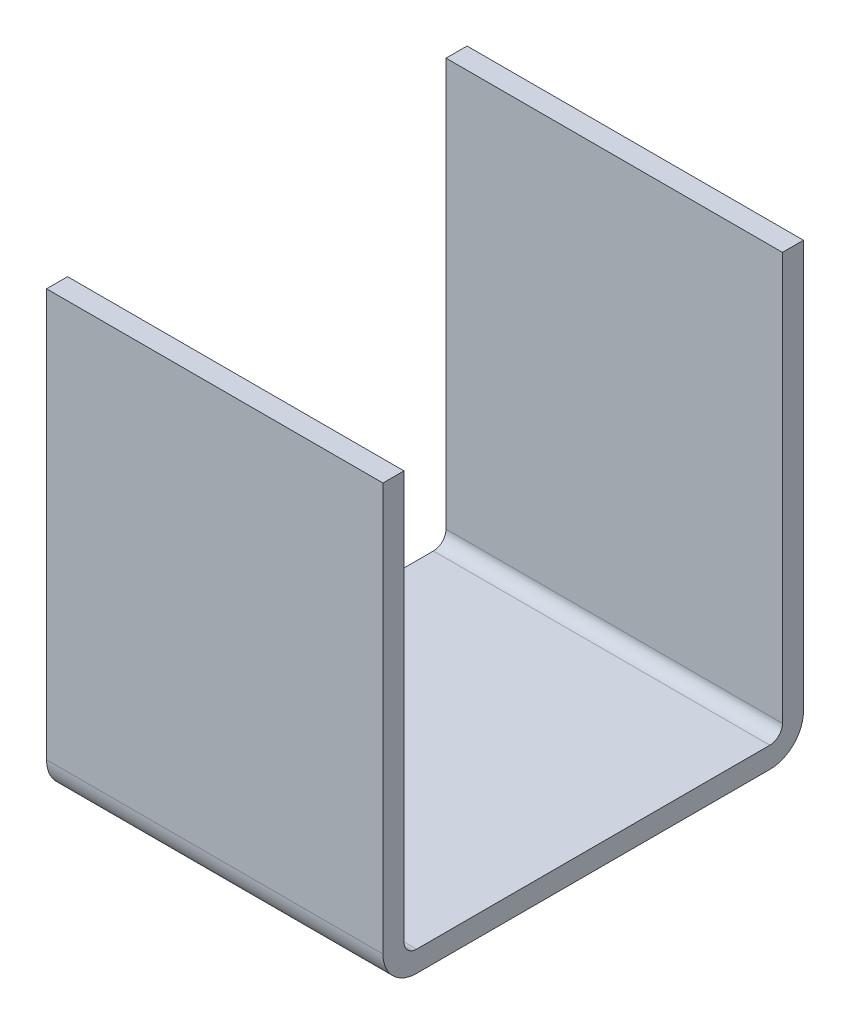
ISO-10303-21;
HEADER;
FILE_DESCRIPTION(('STEP AP214'),'2;1');
FILE_NAME('part.step','',(''),(''),'','','');
FILE_SCHEMA(('AUTOMOTIVE_DESIGN { 1 0 10303 214 1 1 1 1 }'));
ENDSEC;
DATA;
#1=APPLICATION_CONTEXT('core data for automotive mechanical design processes');
#2=APPLICATION_PROTOCOL_DEFINITION('international standard','automotive_design',2000,#1);
#3=PRODUCT_CONTEXT('',#1,'mechanical');
#4=PRODUCT('Part','Part','',(#3));
#5=PRODUCT_RELATED_PRODUCT_CATEGORY('part','',(#4));
#6=PRODUCT_DEFINITION_FORMATION('','',#4);
#7=PRODUCT_DEFINITION_CONTEXT('part definition',#1,'design');
#8=PRODUCT_DEFINITION('design','',#6,#7);
#9=PRODUCT_DEFINITION_SHAPE('','',#8);
#10=(LENGTH_UNIT() NAMED_UNIT(*) SI_UNIT(.MILLI.,.METRE.));
#11=(NAMED_UNIT(*) PLANE_ANGLE_UNIT() SI_UNIT($,.RADIAN.));
#12=(NAMED_UNIT(*) SI_UNIT($,.STERADIAN.) SOLID_ANGLE_UNIT());
#13=UNCERTAINTY_MEASURE_WITH_UNIT(LENGTH_MEASURE(1.E-05),#10,'distance_accuracy_value','');
#14=(GEOMETRIC_REPRESENTATION_CONTEXT(3) GLOBAL_UNCERTAINTY_ASSIGNED_CONTEXT((#13)) GLOBAL_UNIT_ASSIGNED_CONTEXT((#10,
#11,#12)) REPRESENTATION_CONTEXT('',''));
#15=CARTESIAN_POINT('',(0.,0.,0.));
#16=DIRECTION('',(0.,0.,1.));
#17=DIRECTION('',(1.,0.,0.));
#18=AXIS2_PLACEMENT_3D('',#15,#16,#17);
#19=CARTESIAN_POINT('',(0.,2.5,0.));
#20=DIRECTION('',(0.,-1.,0.));
#21=DIRECTION('',(0.,0.,-1.));
#22=AXIS2_PLACEMENT_3D('',#19,#20,#21);
#23=PLANE('',#22);
#24=DIRECTION('',(0.,0.,1.));
#25=VECTOR('',#24,1.);
#26=CARTESIAN_POINT('',(0.,2.5,0.));
#27=LINE('',#26,#25);
#28=CARTESIAN_POINT('',(0.,2.5,-46.));
#29=VERTEX_POINT('',#28);
#30=CARTESIAN_POINT('',(0.,2.5,-3.99999999999999));
#31=VERTEX_POINT('',#30);
#32=EDGE_CURVE('E169',#29,#31,#27,.T.);
#33=ORIENTED_EDGE('',*,*,#32,.T.);
#34=DIRECTION('',(-1.,0.,0.));
#35=VECTOR('',#34,1.);
#36=CARTESIAN_POINT('',(40.,2.5,-4.));
#37=LINE('',#36,#35);
#38=CARTESIAN_POINT('',(40.,2.5,-4.));
#39=VERTEX_POINT('',#38);
#40=EDGE_CURVE('E213',#31,#39,#37,.F.);
#41=ORIENTED_EDGE('',*,*,#40,.T.);
#42=DIRECTION('',(0.,0.,-1.));
#43=VECTOR('',#42,1.);
#44=CARTESIAN_POINT('',(40.,2.5,0.));
#45=LINE('',#44,#43);
#46=CARTESIAN_POINT('',(40.,2.5,-46.));
#47=VERTEX_POINT('',#46);
#48=EDGE_CURVE('E172',#39,#47,#45,.T.);
#49=ORIENTED_EDGE('',*,*,#48,.T.);
#50=DIRECTION('',(1.,0.,0.));
#51=VECTOR('',#50,1.);
#52=CARTESIAN_POINT('',(0.,2.5,-46.));
#53=LINE('',#52,#51);
#54=EDGE_CURVE('E211',#47,#29,#53,.F.);
#55=ORIENTED_EDGE('',*,*,#54,.T.);
#56=EDGE_LOOP('',(#33,#41,#49,#55));
#57=FACE_BOUND('',#56,.T.);
#58=ADVANCED_FACE('F32',(#57),#23,.F.);
#59=CARTESIAN_POINT('',(0.,2.5,0.));
#60=DIRECTION('',(1.,0.,0.));
#61=DIRECTION('',(0.,0.,-1.));
#62=AXIS2_PLACEMENT_3D('',#59,#60,#61);
#63=PLANE('',#62);
#64=DIRECTION('',(0.,0.,1.));
#65=VECTOR('',#64,1.);
#66=CARTESIAN_POINT('',(0.,0.,0.));
#67=LINE('',#66,#65);
#68=CARTESIAN_POINT('',(0.,0.,-46.));
#69=VERTEX_POINT('',#68);
#70=CARTESIAN_POINT('',(0.,0.,-4.));
#71=VERTEX_POINT('',#70);
#72=EDGE_CURVE('E168',#69,#71,#67,.T.);
#73=ORIENTED_EDGE('',*,*,#72,.T.);
#74=CARTESIAN_POINT('',(0.,4.,-4.));
#75=DIRECTION('',(1.,0.,0.));
#76=DIRECTION('',(0.,0.,-1.));
#77=AXIS2_PLACEMENT_3D('',#74,#75,#76);
#78=CIRCLE('',#77,4.);
#79=CARTESIAN_POINT('',(0.,4.,0.));
#80=VERTEX_POINT('',#79);
#81=EDGE_CURVE('E204',#71,#80,#78,.F.);
#82=ORIENTED_EDGE('',*,*,#81,.T.);
#83=DIRECTION('',(0.,-1.,0.));
#84=VECTOR('',#83,1.);
#85=CARTESIAN_POINT('',(0.,2.5,0.));
#86=LINE('',#85,#84);
#87=CARTESIAN_POINT('',(0.,52.5,0.));
#88=VERTEX_POINT('',#87);
#89=EDGE_CURVE('E188',#88,#80,#86,.T.);
#90=ORIENTED_EDGE('',*,*,#89,.F.);
#91=DIRECTION('',(0.,0.,1.));
#92=VECTOR('',#91,1.);
#93=CARTESIAN_POINT('',(0.,52.5,0.));
#94=LINE('',#93,#92);
#95=CARTESIAN_POINT('',(0.,52.5,-2.5));
#96=VERTEX_POINT('',#95);
#97=EDGE_CURVE('E133',#96,#88,#94,.T.);
#98=ORIENTED_EDGE('',*,*,#97,.F.);
#99=DIRECTION('',(0.,-1.,0.));
#100=VECTOR('',#99,1.);
#101=CARTESIAN_POINT('',(0.,52.5,-2.5));
#102=LINE('',#101,#100);
#103=CARTESIAN_POINT('',(0.,4.,-2.5));
#104=VERTEX_POINT('',#103);
#105=EDGE_CURVE('E129',#96,#104,#102,.T.);
#106=ORIENTED_EDGE('',*,*,#105,.T.);
#107=CARTESIAN_POINT('',(0.,4.,-3.99999999999999));
#108=DIRECTION('',(1.,0.,0.));
#109=DIRECTION('',(0.,0.,-1.));
#110=AXIS2_PLACEMENT_3D('',#107,#108,#109);
#111=CIRCLE('',#110,1.5);
#112=EDGE_CURVE('E217',#104,#31,#111,.T.);
#113=ORIENTED_EDGE('',*,*,#112,.T.);
#114=ORIENTED_EDGE('',*,*,#32,.F.);
#115=CARTESIAN_POINT('',(0.,4.,-46.));
#116=DIRECTION('',(1.,0.,0.));
#117=DIRECTION('',(0.,0.,-1.));
#118=AXIS2_PLACEMENT_3D('',#115,#116,#117);
#119=CIRCLE('',#118,1.5);
#120=CARTESIAN_POINT('',(0.,4.,-47.5));
#121=VERTEX_POINT('',#120);
#122=EDGE_CURVE('E11',#29,#121,#119,.T.);
#123=ORIENTED_EDGE('',*,*,#122,.T.);
#124=DIRECTION('',(0.,-1.,0.));
#125=VECTOR('',#124,1.);
#126=CARTESIAN_POINT('',(0.,52.5,-47.5));
#127=LINE('',#126,#125);
#128=CARTESIAN_POINT('',(0.,52.5,-47.5));
#129=VERTEX_POINT('',#128);
#130=EDGE_CURVE('E166',#129,#121,#127,.T.);
#131=ORIENTED_EDGE('',*,*,#130,.F.);
#132=DIRECTION('',(0.,0.,1.));
#133=VECTOR('',#132,1.);
#134=CARTESIAN_POINT('',(0.,52.5,-50.));
#135=LINE('',#134,#133);
#136=CARTESIAN_POINT('',(0.,52.5,-50.));
#137=VERTEX_POINT('',#136);
#138=EDGE_CURVE('E148',#137,#129,#135,.T.);
#139=ORIENTED_EDGE('',*,*,#138,.F.);
#140=DIRECTION('',(0.,-1.,0.));
#141=VECTOR('',#140,1.);
#142=CARTESIAN_POINT('',(0.,2.5,-50.));
#143=LINE('',#142,#141);
#144=CARTESIAN_POINT('',(0.,4.,-50.));
#145=VERTEX_POINT('',#144);
#146=EDGE_CURVE('E176',#137,#145,#143,.T.);
#147=ORIENTED_EDGE('',*,*,#146,.T.);
#148=CARTESIAN_POINT('',(0.,4.,-46.));
#149=DIRECTION('',(1.,0.,0.));
#150=DIRECTION('',(0.,0.,-1.));
#151=AXIS2_PLACEMENT_3D('',#148,#149,#150);
#152=CIRCLE('',#151,4.);
#153=EDGE_CURVE('E202',#145,#69,#152,.F.);
#154=ORIENTED_EDGE('',*,*,#153,.T.);
#155=EDGE_LOOP('',(#73,#82,#90,#98,#106,#113,#114,#123,#131,#139,#147,#154));
#156=FACE_BOUND('',#155,.T.);
#157=ADVANCED_FACE('F226',(#156),#63,.F.);
#158=CARTESIAN_POINT('',(0.,2.5,0.));
#159=DIRECTION('',(0.,0.,-1.));
#160=DIRECTION('',(-1.,0.,0.));
#161=AXIS2_PLACEMENT_3D('',#158,#159,#160);
#162=PLANE('',#161);
#163=ORIENTED_EDGE('',*,*,#89,.T.);
#164=DIRECTION('',(1.,0.,0.));
#165=VECTOR('',#164,1.);
#166=CARTESIAN_POINT('',(40.,4.,0.));
#167=LINE('',#166,#165);
#168=CARTESIAN_POINT('',(40.,4.,0.));
#169=VERTEX_POINT('',#168);
#170=EDGE_CURVE('E191',#80,#169,#167,.T.);
#171=ORIENTED_EDGE('',*,*,#170,.T.);
#172=DIRECTION('',(0.,-1.,0.));
#173=VECTOR('',#172,1.);
#174=CARTESIAN_POINT('',(40.,2.5,0.));
#175=LINE('',#174,#173);
#176=CARTESIAN_POINT('',(40.,52.5,0.));
#177=VERTEX_POINT('',#176);
#178=EDGE_CURVE('E186',#177,#169,#175,.T.);
#179=ORIENTED_EDGE('',*,*,#178,.F.);
#180=DIRECTION('',(1.,0.,0.));
#181=VECTOR('',#180,1.);
#182=CARTESIAN_POINT('',(40.,52.5,0.));
#183=LINE('',#182,#181);
#184=EDGE_CURVE('E140',#88,#177,#183,.T.);
#185=ORIENTED_EDGE('',*,*,#184,.F.);
#186=EDGE_LOOP('',(#163,#171,#179,#185));
#187=FACE_BOUND('',#186,.T.);
#188=ADVANCED_FACE('F247',(#187),#162,.F.);
#189=CARTESIAN_POINT('',(40.,2.5,0.));
#190=DIRECTION('',(-1.,0.,0.));
#191=DIRECTION('',(0.,0.,1.));
#192=AXIS2_PLACEMENT_3D('',#189,#190,#191);
#193=PLANE('',#192);
#194=ORIENTED_EDGE('',*,*,#178,.T.);
#195=CARTESIAN_POINT('',(40.,4.,-4.));
#196=DIRECTION('',(-1.,0.,0.));
#197=DIRECTION('',(0.,0.,1.));
#198=AXIS2_PLACEMENT_3D('',#195,#196,#197);
#199=CIRCLE('',#198,4.);
#200=CARTESIAN_POINT('',(40.,0.,-4.));
#201=VERTEX_POINT('',#200);
#202=EDGE_CURVE('E196',#169,#201,#199,.F.);
#203=ORIENTED_EDGE('',*,*,#202,.T.);
#204=DIRECTION('',(0.,0.,-1.));
#205=VECTOR('',#204,1.);
#206=CARTESIAN_POINT('',(40.,0.,0.));
#207=LINE('',#206,#205);
#208=CARTESIAN_POINT('',(40.,0.,-46.));
#209=VERTEX_POINT('',#208);
#210=EDGE_CURVE('E173',#201,#209,#207,.T.);
#211=ORIENTED_EDGE('',*,*,#210,.T.);
#212=CARTESIAN_POINT('',(40.,4.,-46.));
#213=DIRECTION('',(-1.,0.,0.));
#214=DIRECTION('',(0.,0.,1.));
#215=AXIS2_PLACEMENT_3D('',#212,#213,#214);
#216=CIRCLE('',#215,4.);
#217=CARTESIAN_POINT('',(40.,4.,-50.));
#218=VERTEX_POINT('',#217);
#219=EDGE_CURVE('E194',#209,#218,#216,.F.);
#220=ORIENTED_EDGE('',*,*,#219,.T.);
#221=DIRECTION('',(0.,-1.,0.));
#222=VECTOR('',#221,1.);
#223=CARTESIAN_POINT('',(40.,2.5,-50.));
#224=LINE('',#223,#222);
#225=CARTESIAN_POINT('',(40.,52.5,-50.));
#226=VERTEX_POINT('',#225);
#227=EDGE_CURVE('E183',#226,#218,#224,.T.);
#228=ORIENTED_EDGE('',*,*,#227,.F.);
#229=DIRECTION('',(0.,0.,-1.));
#230=VECTOR('',#229,1.);
#231=CARTESIAN_POINT('',(40.,52.5,-50.));
#232=LINE('',#231,#230);
#233=CARTESIAN_POINT('',(40.,52.5,-47.5));
#234=VERTEX_POINT('',#233);
#235=EDGE_CURVE('E157',#234,#226,#232,.T.);
#236=ORIENTED_EDGE('',*,*,#235,.F.);
#237=DIRECTION('',(0.,-1.,0.));
#238=VECTOR('',#237,1.);
#239=CARTESIAN_POINT('',(40.,52.5,-47.5));
#240=LINE('',#239,#238);
#241=CARTESIAN_POINT('',(40.,4.,-47.5));
#242=VERTEX_POINT('',#241);
#243=EDGE_CURVE('E163',#234,#242,#240,.T.);
#244=ORIENTED_EDGE('',*,*,#243,.T.);
#245=CARTESIAN_POINT('',(40.,4.,-46.));
#246=DIRECTION('',(-1.,0.,0.));
#247=DIRECTION('',(0.,0.,1.));
#248=AXIS2_PLACEMENT_3D('',#245,#246,#247);
#249=CIRCLE('',#248,1.5);
#250=EDGE_CURVE('E40',#242,#47,#249,.T.);
#251=ORIENTED_EDGE('',*,*,#250,.T.);
#252=ORIENTED_EDGE('',*,*,#48,.F.);
#253=CARTESIAN_POINT('',(40.,4.,-4.));
#254=DIRECTION('',(-1.,0.,0.));
#255=DIRECTION('',(0.,0.,1.));
#256=AXIS2_PLACEMENT_3D('',#253,#254,#255);
#257=CIRCLE('',#256,1.5);
#258=CARTESIAN_POINT('',(40.,4.,-2.5));
#259=VERTEX_POINT('',#258);
#260=EDGE_CURVE('E147',#39,#259,#257,.T.);
#261=ORIENTED_EDGE('',*,*,#260,.T.);
#262=DIRECTION('',(0.,-1.,0.));
#263=VECTOR('',#262,1.);
#264=CARTESIAN_POINT('',(40.,52.5,-2.5));
#265=LINE('',#264,#263);
#266=CARTESIAN_POINT('',(40.,52.5,-2.5));
#267=VERTEX_POINT('',#266);
#268=EDGE_CURVE('E126',#267,#259,#265,.T.);
#269=ORIENTED_EDGE('',*,*,#268,.F.);
#270=DIRECTION('',(0.,0.,-1.));
#271=VECTOR('',#270,1.);
#272=CARTESIAN_POINT('',(40.,52.5,0.));
#273=LINE('',#272,#271);
#274=EDGE_CURVE('E134',#177,#267,#273,.T.);
#275=ORIENTED_EDGE('',*,*,#274,.F.);
#276=EDGE_LOOP('',(#194,#203,#211,#220,#228,#236,#244,#251,#252,#261,#269,#275));
#277=FACE_BOUND('',#276,.T.);
#278=ADVANCED_FACE('F144',(#277),#193,.F.);
#279=CARTESIAN_POINT('',(0.,2.5,-50.));
#280=DIRECTION('',(0.,0.,1.));
#281=DIRECTION('',(1.,0.,0.));
#282=AXIS2_PLACEMENT_3D('',#279,#280,#281);
#283=PLANE('',#282);
#284=ORIENTED_EDGE('',*,*,#227,.T.);
#285=DIRECTION('',(-1.,0.,0.));
#286=VECTOR('',#285,1.);
#287=CARTESIAN_POINT('',(0.,4.,-50.));
#288=LINE('',#287,#286);
#289=EDGE_CURVE('E206',#218,#145,#288,.T.);
#290=ORIENTED_EDGE('',*,*,#289,.T.);
#291=ORIENTED_EDGE('',*,*,#146,.F.);
#292=DIRECTION('',(-1.,0.,0.));
#293=VECTOR('',#292,1.);
#294=CARTESIAN_POINT('',(0.,52.5,-50.));
#295=LINE('',#294,#293);
#296=EDGE_CURVE('E160',#226,#137,#295,.T.);
#297=ORIENTED_EDGE('',*,*,#296,.F.);
#298=EDGE_LOOP('',(#284,#290,#291,#297));
#299=FACE_BOUND('',#298,.T.);
#300=ADVANCED_FACE('F231',(#299),#283,.F.);
#301=CARTESIAN_POINT('',(0.,0.,0.));
#302=DIRECTION('',(0.,-1.,0.));
#303=DIRECTION('',(0.,0.,-1.));
#304=AXIS2_PLACEMENT_3D('',#301,#302,#303);
#305=PLANE('',#304);
#306=ORIENTED_EDGE('',*,*,#210,.F.);
#307=DIRECTION('',(1.,0.,0.));
#308=VECTOR('',#307,1.);
#309=CARTESIAN_POINT('',(0.,0.,-4.));
#310=LINE('',#309,#308);
#311=EDGE_CURVE('E200',#201,#71,#310,.F.);
#312=ORIENTED_EDGE('',*,*,#311,.T.);
#313=ORIENTED_EDGE('',*,*,#72,.F.);
#314=DIRECTION('',(-1.,0.,0.));
#315=VECTOR('',#314,1.);
#316=CARTESIAN_POINT('',(40.,0.,-46.));
#317=LINE('',#316,#315);
#318=EDGE_CURVE('E198',#69,#209,#317,.F.);
#319=ORIENTED_EDGE('',*,*,#318,.T.);
#320=EDGE_LOOP('',(#306,#312,#313,#319));
#321=FACE_BOUND('',#320,.T.);
#322=ADVANCED_FACE('F241',(#321),#305,.T.);
#323=CARTESIAN_POINT('',(0.,52.5,-47.5));
#324=DIRECTION('',(0.,0.,-1.));
#325=DIRECTION('',(-1.,0.,0.));
#326=AXIS2_PLACEMENT_3D('',#323,#324,#325);
#327=PLANE('',#326);
#328=ORIENTED_EDGE('',*,*,#130,.T.);
#329=DIRECTION('',(1.,0.,0.));
#330=VECTOR('',#329,1.);
#331=CARTESIAN_POINT('',(40.,4.,-47.5));
#332=LINE('',#331,#330);
#333=EDGE_CURVE('E215',#121,#242,#332,.T.);
#334=ORIENTED_EDGE('',*,*,#333,.T.);
#335=ORIENTED_EDGE('',*,*,#243,.F.);
#336=DIRECTION('',(1.,0.,0.));
#337=VECTOR('',#336,1.);
#338=CARTESIAN_POINT('',(0.,52.5,-47.5));
#339=LINE('',#338,#337);
#340=EDGE_CURVE('E151',#129,#234,#339,.T.);
#341=ORIENTED_EDGE('',*,*,#340,.F.);
#342=EDGE_LOOP('',(#328,#334,#335,#341));
#343=FACE_BOUND('',#342,.T.);
#344=ADVANCED_FACE('F224',(#343),#327,.F.);
#345=CARTESIAN_POINT('',(0.,52.5,0.));
#346=DIRECTION('',(0.,1.,0.));
#347=DIRECTION('',(0.,0.,1.));
#348=AXIS2_PLACEMENT_3D('',#345,#346,#347);
#349=PLANE('',#348);
#350=ORIENTED_EDGE('',*,*,#138,.T.);
#351=ORIENTED_EDGE('',*,*,#340,.T.);
#352=ORIENTED_EDGE('',*,*,#235,.T.);
#353=ORIENTED_EDGE('',*,*,#296,.T.);
#354=EDGE_LOOP('',(#350,#351,#352,#353));
#355=FACE_BOUND('',#354,.T.);
#356=ADVANCED_FACE('F228',(#355),#349,.T.);
#357=CARTESIAN_POINT('',(40.,52.5,-2.5));
#358=DIRECTION('',(0.,0.,1.));
#359=DIRECTION('',(1.,0.,0.));
#360=AXIS2_PLACEMENT_3D('',#357,#358,#359);
#361=PLANE('',#360);
#362=ORIENTED_EDGE('',*,*,#268,.T.);
#363=DIRECTION('',(-1.,0.,0.));
#364=VECTOR('',#363,1.);
#365=CARTESIAN_POINT('',(0.,4.,-2.5));
#366=LINE('',#365,#364);
#367=EDGE_CURVE('E209',#259,#104,#366,.T.);
#368=ORIENTED_EDGE('',*,*,#367,.T.);
#369=ORIENTED_EDGE('',*,*,#105,.F.);
#370=DIRECTION('',(-1.,0.,0.));
#371=VECTOR('',#370,1.);
#372=CARTESIAN_POINT('',(40.,52.5,-2.5));
#373=LINE('',#372,#371);
#374=EDGE_CURVE('E121',#267,#96,#373,.T.);
#375=ORIENTED_EDGE('',*,*,#374,.F.);
#376=EDGE_LOOP('',(#362,#368,#369,#375));
#377=FACE_BOUND('',#376,.T.);
#378=ADVANCED_FACE('F123',(#377),#361,.F.);
#379=CARTESIAN_POINT('',(0.,52.5,0.));
#380=DIRECTION('',(0.,1.,0.));
#381=DIRECTION('',(0.,0.,1.));
#382=AXIS2_PLACEMENT_3D('',#379,#380,#381);
#383=PLANE('',#382);
#384=ORIENTED_EDGE('',*,*,#274,.T.);
#385=ORIENTED_EDGE('',*,*,#374,.T.);
#386=ORIENTED_EDGE('',*,*,#97,.T.);
#387=ORIENTED_EDGE('',*,*,#184,.T.);
#388=EDGE_LOOP('',(#384,#385,#386,#387));
#389=FACE_BOUND('',#388,.T.);
#390=ADVANCED_FACE('F138',(#389),#383,.T.);
#391=CARTESIAN_POINT('',(0.,4.,-4.));
#392=DIRECTION('',(-1.,0.,0.));
#393=DIRECTION('',(0.,0.,1.));
#394=AXIS2_PLACEMENT_3D('',#391,#392,#393);
#395=CYLINDRICAL_SURFACE('',#394,4.);
#396=ORIENTED_EDGE('',*,*,#81,.F.);
#397=ORIENTED_EDGE('',*,*,#311,.F.);
#398=ORIENTED_EDGE('',*,*,#202,.F.);
#399=ORIENTED_EDGE('',*,*,#170,.F.);
#400=EDGE_LOOP('',(#396,#397,#398,#399));
#401=FACE_BOUND('',#400,.T.);
#402=ADVANCED_FACE('F244',(#401),#395,.T.);
#403=CARTESIAN_POINT('',(0.,4.,-46.));
#404=DIRECTION('',(1.,0.,0.));
#405=DIRECTION('',(0.,0.,-1.));
#406=AXIS2_PLACEMENT_3D('',#403,#404,#405);
#407=CYLINDRICAL_SURFACE('',#406,4.);
#408=ORIENTED_EDGE('',*,*,#219,.F.);
#409=ORIENTED_EDGE('',*,*,#318,.F.);
#410=ORIENTED_EDGE('',*,*,#153,.F.);
#411=ORIENTED_EDGE('',*,*,#289,.F.);
#412=EDGE_LOOP('',(#408,#409,#410,#411));
#413=FACE_BOUND('',#412,.T.);
#414=ADVANCED_FACE('F235',(#413),#407,.T.);
#415=CARTESIAN_POINT('',(40.,4.,-4.));
#416=DIRECTION('',(1.,0.,0.));
#417=DIRECTION('',(0.,0.,-1.));
#418=AXIS2_PLACEMENT_3D('',#415,#416,#417);
#419=CYLINDRICAL_SURFACE('',#418,1.5);
#420=ORIENTED_EDGE('',*,*,#260,.F.);
#421=ORIENTED_EDGE('',*,*,#40,.F.);
#422=ORIENTED_EDGE('',*,*,#112,.F.);
#423=ORIENTED_EDGE('',*,*,#367,.F.);
#424=EDGE_LOOP('',(#420,#421,#422,#423));
#425=FACE_BOUND('',#424,.T.);
#426=ADVANCED_FACE('F250',(#425),#419,.F.);
#427=CARTESIAN_POINT('',(0.,4.,-46.));
#428=DIRECTION('',(-1.,0.,0.));
#429=DIRECTION('',(0.,0.,1.));
#430=AXIS2_PLACEMENT_3D('',#427,#428,#429);
#431=CYLINDRICAL_SURFACE('',#430,1.5);
#432=ORIENTED_EDGE('',*,*,#122,.F.);
#433=ORIENTED_EDGE('',*,*,#54,.F.);
#434=ORIENTED_EDGE('',*,*,#250,.F.);
#435=ORIENTED_EDGE('',*,*,#333,.F.);
#436=EDGE_LOOP('',(#432,#433,#434,#435));
#437=FACE_BOUND('',#436,.T.);
#438=ADVANCED_FACE('F34',(#437),#431,.F.);
#439=CLOSED_SHELL('',(#58,#157,#188,#278,#300,#322,#344,#356,#378,#390,#402,#414,#426,#438));
#440=MANIFOLD_SOLID_BREP('B2',#439);
#441=ADVANCED_BREP_SHAPE_REPRESENTATION('',(#18,#440),#14);
#442=SHAPE_DEFINITION_REPRESENTATION(#9,#441);
ENDSEC;
END-ISO-10303-21;
